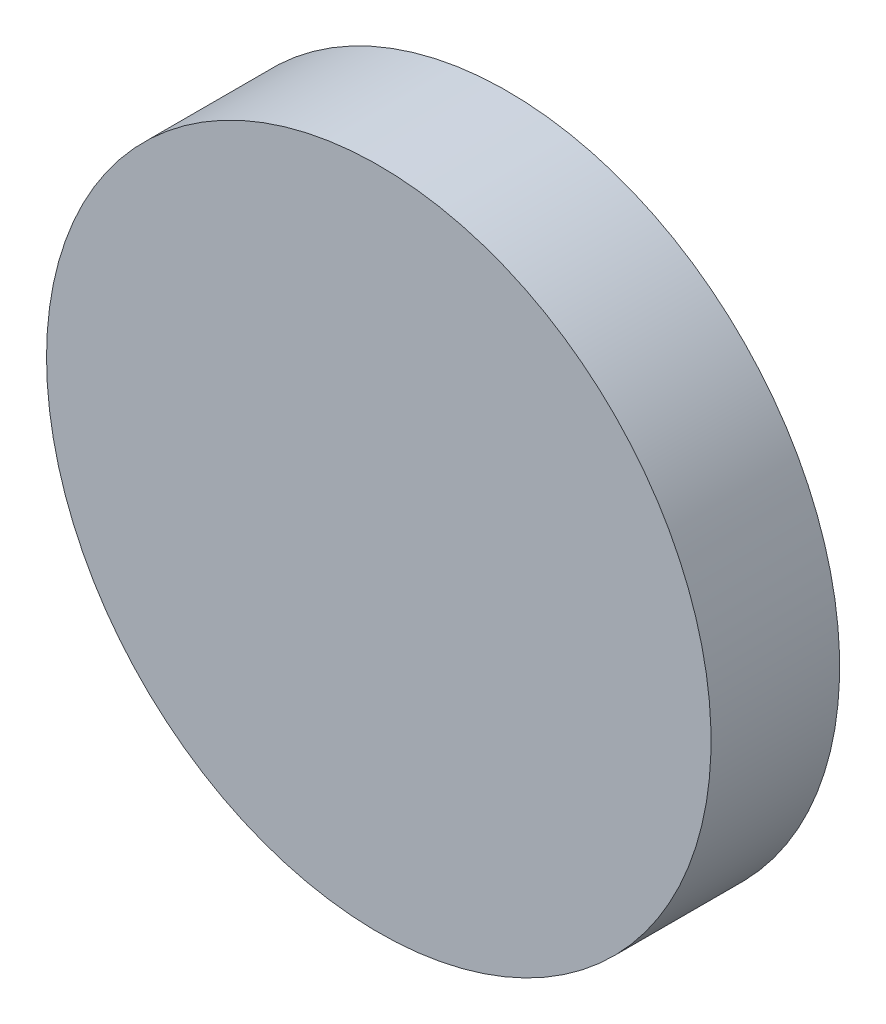
ISO-10303-21;
HEADER;
FILE_DESCRIPTION(('STEP AP214'),'2;1');
FILE_NAME('part.step','',(''),(''),'','','');
FILE_SCHEMA(('AUTOMOTIVE_DESIGN { 1 0 10303 214 1 1 1 1 }'));
ENDSEC;
DATA;
#1=APPLICATION_CONTEXT('core data for automotive mechanical design processes');
#2=APPLICATION_PROTOCOL_DEFINITION('international standard','automotive_design',2000,#1);
#3=PRODUCT_CONTEXT('',#1,'mechanical');
#4=PRODUCT('Part','Part','',(#3));
#5=PRODUCT_RELATED_PRODUCT_CATEGORY('part','',(#4));
#6=PRODUCT_DEFINITION_FORMATION('','',#4);
#7=PRODUCT_DEFINITION_CONTEXT('part definition',#1,'design');
#8=PRODUCT_DEFINITION('design','',#6,#7);
#9=PRODUCT_DEFINITION_SHAPE('','',#8);
#10=(LENGTH_UNIT() NAMED_UNIT(*) SI_UNIT(.MILLI.,.METRE.));
#11=(NAMED_UNIT(*) PLANE_ANGLE_UNIT() SI_UNIT($,.RADIAN.));
#12=(NAMED_UNIT(*) SI_UNIT($,.STERADIAN.) SOLID_ANGLE_UNIT());
#13=UNCERTAINTY_MEASURE_WITH_UNIT(LENGTH_MEASURE(1.E-05),#10,'distance_accuracy_value','');
#14=(GEOMETRIC_REPRESENTATION_CONTEXT(3) GLOBAL_UNCERTAINTY_ASSIGNED_CONTEXT((#13)) GLOBAL_UNIT_ASSIGNED_CONTEXT((#10,
#11,#12)) REPRESENTATION_CONTEXT('',''));
#15=CARTESIAN_POINT('',(0.,0.,0.));
#16=DIRECTION('',(0.,0.,1.));
#17=DIRECTION('',(1.,0.,0.));
#18=AXIS2_PLACEMENT_3D('',#15,#16,#17);
#19=CARTESIAN_POINT('',(0.,0.,30.48));
#20=DIRECTION('',(0.,0.,-1.));
#21=DIRECTION('',(-1.,0.,0.));
#22=AXIS2_PLACEMENT_3D('',#19,#20,#21);
#23=CYLINDRICAL_SURFACE('',#22,78.74);
#24=CARTESIAN_POINT('',(0.,0.,30.48));
#25=DIRECTION('',(0.,0.,1.));
#26=DIRECTION('',(1.,0.,0.));
#27=AXIS2_PLACEMENT_3D('',#24,#25,#26);
#28=CIRCLE('',#27,78.74);
#29=CARTESIAN_POINT('',(-78.74,0.,30.48));
#30=VERTEX_POINT('',#29);
#31=EDGE_CURVE('E10',#30,#30,#28,.T.);
#32=CARTESIAN_POINT('',(0.,0.,0.));
#33=DIRECTION('',(0.,0.,1.));
#34=DIRECTION('',(1.,0.,0.));
#35=AXIS2_PLACEMENT_3D('',#32,#33,#34);
#36=CIRCLE('',#35,78.74);
#37=CARTESIAN_POINT('',(-78.74,0.,0.));
#38=VERTEX_POINT('',#37);
#39=EDGE_CURVE('E34',#38,#38,#36,.T.);
#40=CARTESIAN_POINT('',(-78.74,0.,30.48));
#41=CARTESIAN_POINT('',(-78.74,0.,30.1625));
#42=CARTESIAN_POINT('',(-78.74,0.,29.845));
#43=CARTESIAN_POINT('',(-78.74,0.,29.21));
#44=CARTESIAN_POINT('',(-78.74,0.,28.8925));
#45=CARTESIAN_POINT('',(-78.74,0.,28.2575));
#46=CARTESIAN_POINT('',(-78.74,0.,27.94));
#47=CARTESIAN_POINT('',(-78.74,0.,27.305));
#48=CARTESIAN_POINT('',(-78.74,0.,26.9875));
#49=CARTESIAN_POINT('',(-78.74,0.,26.3525));
#50=CARTESIAN_POINT('',(-78.74,0.,26.035));
#51=CARTESIAN_POINT('',(-78.74,0.,25.4));
#52=CARTESIAN_POINT('',(-78.74,0.,25.0825));
#53=CARTESIAN_POINT('',(-78.74,0.,24.4475));
#54=CARTESIAN_POINT('',(-78.74,0.,24.13));
#55=CARTESIAN_POINT('',(-78.74,0.,23.495));
#56=CARTESIAN_POINT('',(-78.74,0.,23.1775));
#57=CARTESIAN_POINT('',(-78.74,0.,22.5425));
#58=CARTESIAN_POINT('',(-78.74,0.,22.225));
#59=CARTESIAN_POINT('',(-78.74,0.,21.59));
#60=CARTESIAN_POINT('',(-78.74,0.,21.2725));
#61=CARTESIAN_POINT('',(-78.74,0.,20.6375));
#62=CARTESIAN_POINT('',(-78.74,0.,20.32));
#63=CARTESIAN_POINT('',(-78.74,0.,19.685));
#64=CARTESIAN_POINT('',(-78.74,0.,19.3675));
#65=CARTESIAN_POINT('',(-78.74,0.,18.7325));
#66=CARTESIAN_POINT('',(-78.74,0.,18.415));
#67=CARTESIAN_POINT('',(-78.74,0.,17.78));
#68=CARTESIAN_POINT('',(-78.74,0.,17.4625));
#69=CARTESIAN_POINT('',(-78.74,0.,16.8275));
#70=CARTESIAN_POINT('',(-78.74,0.,16.51));
#71=CARTESIAN_POINT('',(-78.74,0.,15.875));
#72=CARTESIAN_POINT('',(-78.74,0.,15.5575));
#73=CARTESIAN_POINT('',(-78.74,0.,14.9225));
#74=CARTESIAN_POINT('',(-78.74,0.,14.605));
#75=CARTESIAN_POINT('',(-78.74,0.,13.97));
#76=CARTESIAN_POINT('',(-78.74,0.,13.6525));
#77=CARTESIAN_POINT('',(-78.74,0.,13.0175));
#78=CARTESIAN_POINT('',(-78.74,0.,12.7));
#79=CARTESIAN_POINT('',(-78.74,0.,12.065));
#80=CARTESIAN_POINT('',(-78.74,0.,11.7475));
#81=CARTESIAN_POINT('',(-78.74,0.,11.1125));
#82=CARTESIAN_POINT('',(-78.74,0.,10.795));
#83=CARTESIAN_POINT('',(-78.74,0.,10.16));
#84=CARTESIAN_POINT('',(-78.74,0.,9.8425));
#85=CARTESIAN_POINT('',(-78.74,0.,9.2075));
#86=CARTESIAN_POINT('',(-78.74,0.,8.89));
#87=CARTESIAN_POINT('',(-78.74,0.,8.255));
#88=CARTESIAN_POINT('',(-78.74,0.,7.9375));
#89=CARTESIAN_POINT('',(-78.74,0.,7.3025));
#90=CARTESIAN_POINT('',(-78.74,0.,6.985));
#91=CARTESIAN_POINT('',(-78.74,0.,6.35));
#92=CARTESIAN_POINT('',(-78.74,0.,6.0325));
#93=CARTESIAN_POINT('',(-78.74,0.,5.3975));
#94=CARTESIAN_POINT('',(-78.74,0.,5.08));
#95=CARTESIAN_POINT('',(-78.74,0.,4.445));
#96=CARTESIAN_POINT('',(-78.74,0.,4.1275));
#97=CARTESIAN_POINT('',(-78.74,0.,3.4925));
#98=CARTESIAN_POINT('',(-78.74,0.,3.175));
#99=CARTESIAN_POINT('',(-78.74,0.,2.54));
#100=CARTESIAN_POINT('',(-78.74,0.,2.2225));
#101=CARTESIAN_POINT('',(-78.74,0.,1.5875));
#102=CARTESIAN_POINT('',(-78.74,0.,1.27));
#103=CARTESIAN_POINT('',(-78.74,0.,0.634999999999999));
#104=CARTESIAN_POINT('',(-78.74,0.,0.3175));
#105=CARTESIAN_POINT('',(-78.74,0.,0.));
#106=B_SPLINE_CURVE_WITH_KNOTS('',3,(#40,#41,#42,#43,#44,#45,#46,#47,#48,#49,#50,#51,#52,#53,
#54,#55,#56,#57,#58,#59,#60,#61,#62,#63,#64,#65,#66,#67,#68,#69,#70,#71,#72,#73,#74,#75,#76,#77,
#78,#79,#80,#81,#82,#83,#84,#85,#86,#87,#88,#89,#90,#91,#92,#93,#94,#95,#96,#97,#98,#99,#100,
#101,#102,#103,#104,#105),.UNSPECIFIED.,.F.,.F.,(4,2,2,2,2,2,2,2,2,2,2,2,2,2,2,2,2,2,2,2,2,2,2,
2,2,2,2,2,2,2,2,2,4),(0.,0.952499999999998,1.905,2.8575,3.81,4.7625,5.715,6.6675,
7.61999999999999,8.5725,9.525,10.4775,11.43,12.3825,13.335,14.2875,15.24,16.1925,17.145,18.0975,
19.05,20.0025,20.955,21.9075,22.86,23.8125,24.765,25.7175,26.67,27.6225,28.575,29.5275,30.48),.UNSPECIFIED.);
#107=EDGE_CURVE('BSEAM31',#30,#38,#106,.T.);
#108=ORIENTED_EDGE('',*,*,#31,.F.);
#109=ORIENTED_EDGE('',*,*,#39,.T.);
#110=ORIENTED_EDGE('',*,*,#107,.T.);
#111=ORIENTED_EDGE('',*,*,#107,.F.);
#112=EDGE_LOOP('',(#108,#110,#109,#111));
#113=FACE_BOUND('',#112,.T.);
#114=ADVANCED_FACE('F31',(#113),#23,.T.);
#115=CARTESIAN_POINT('',(0.,0.,30.48));
#116=DIRECTION('',(0.,0.,1.));
#117=DIRECTION('',(1.,0.,0.));
#118=AXIS2_PLACEMENT_3D('',#115,#116,#117);
#119=PLANE('',#118);
#120=ORIENTED_EDGE('',*,*,#31,.T.);
#121=EDGE_LOOP('',(#120));
#122=FACE_BOUND('',#121,.T.);
#123=ADVANCED_FACE('F46',(#122),#119,.T.);
#124=CARTESIAN_POINT('',(0.,0.,0.));
#125=DIRECTION('',(0.,0.,1.));
#126=DIRECTION('',(1.,0.,0.));
#127=AXIS2_PLACEMENT_3D('',#124,#125,#126);
#128=PLANE('',#127);
#129=ORIENTED_EDGE('',*,*,#39,.F.);
#130=EDGE_LOOP('',(#129));
#131=FACE_BOUND('',#130,.T.);
#132=ADVANCED_FACE('F44',(#131),#128,.F.);
#133=CLOSED_SHELL('',(#114,#123,#132));
#134=MANIFOLD_SOLID_BREP('B2',#133);
#135=ADVANCED_BREP_SHAPE_REPRESENTATION('',(#18,#134),#14);
#136=SHAPE_DEFINITION_REPRESENTATION(#9,#135);
ENDSEC;
END-ISO-10303-21;
